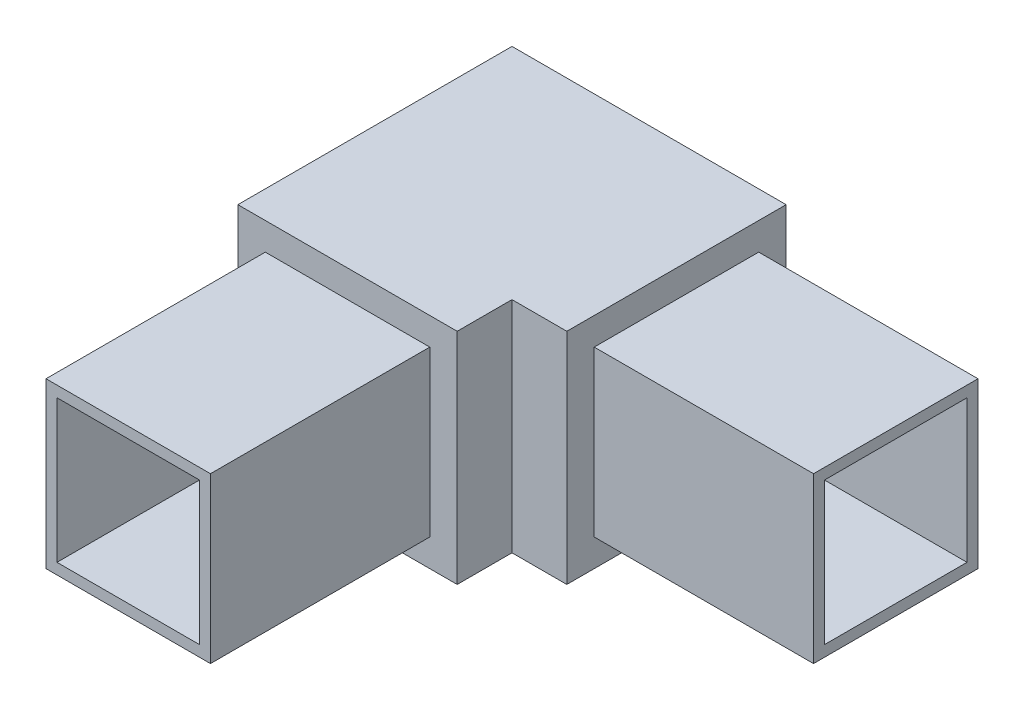
ISO-10303-21;
HEADER;
FILE_DESCRIPTION(('STEP AP214'),'2;1');
FILE_NAME('part.step','',(''),(''),'','','');
FILE_SCHEMA(('AUTOMOTIVE_DESIGN { 1 0 10303 214 1 1 1 1 }'));
ENDSEC;
DATA;
#1=APPLICATION_CONTEXT('core data for automotive mechanical design processes');
#2=APPLICATION_PROTOCOL_DEFINITION('international standard','automotive_design',2000,#1);
#3=PRODUCT_CONTEXT('',#1,'mechanical');
#4=PRODUCT('Part','Part','',(#3));
#5=PRODUCT_RELATED_PRODUCT_CATEGORY('part','',(#4));
#6=PRODUCT_DEFINITION_FORMATION('','',#4);
#7=PRODUCT_DEFINITION_CONTEXT('part definition',#1,'design');
#8=PRODUCT_DEFINITION('design','',#6,#7);
#9=PRODUCT_DEFINITION_SHAPE('','',#8);
#10=(LENGTH_UNIT() NAMED_UNIT(*) SI_UNIT(.MILLI.,.METRE.));
#11=(NAMED_UNIT(*) PLANE_ANGLE_UNIT() SI_UNIT($,.RADIAN.));
#12=(NAMED_UNIT(*) SI_UNIT($,.STERADIAN.) SOLID_ANGLE_UNIT());
#13=UNCERTAINTY_MEASURE_WITH_UNIT(LENGTH_MEASURE(1.E-05),#10,'distance_accuracy_value','');
#14=(GEOMETRIC_REPRESENTATION_CONTEXT(3) GLOBAL_UNCERTAINTY_ASSIGNED_CONTEXT((#13)) GLOBAL_UNIT_ASSIGNED_CONTEXT((#10,
#11,#12)) REPRESENTATION_CONTEXT('',''));
#15=CARTESIAN_POINT('',(0.,0.,0.));
#16=DIRECTION('',(0.,0.,1.));
#17=DIRECTION('',(1.,0.,0.));
#18=AXIS2_PLACEMENT_3D('',#15,#16,#17);
#19=CARTESIAN_POINT('',(70.,40.,-1082.0432663456));
#20=DIRECTION('',(-1.,0.,0.));
#21=DIRECTION('',(0.,0.,-1.));
#22=AXIS2_PLACEMENT_3D('',#19,#20,#21);
#23=PLANE('',#22);
#24=DIRECTION('',(0.,-1.,0.));
#25=VECTOR('',#24,1.);
#26=CARTESIAN_POINT('',(70.,35.,-1115.));
#27=LINE('',#26,#25);
#28=CARTESIAN_POINT('',(70.,35.,-1115.));
#29=VERTEX_POINT('',#28);
#30=CARTESIAN_POINT('',(70.,5.,-1115.));
#31=VERTEX_POINT('',#30);
#32=EDGE_CURVE('E383',#29,#31,#27,.T.);
#33=ORIENTED_EDGE('',*,*,#32,.F.);
#34=DIRECTION('',(0.,0.,-1.));
#35=VECTOR('',#34,1.);
#36=CARTESIAN_POINT('',(70.,35.,-1085.));
#37=LINE('',#36,#35);
#38=CARTESIAN_POINT('',(70.,35.,-1085.));
#39=VERTEX_POINT('',#38);
#40=EDGE_CURVE('E388',#39,#29,#37,.T.);
#41=ORIENTED_EDGE('',*,*,#40,.F.);
#42=DIRECTION('',(0.,1.,0.));
#43=VECTOR('',#42,1.);
#44=CARTESIAN_POINT('',(70.,5.,-1085.));
#45=LINE('',#44,#43);
#46=CARTESIAN_POINT('',(70.,5.,-1085.));
#47=VERTEX_POINT('',#46);
#48=EDGE_CURVE('E403',#47,#39,#45,.T.);
#49=ORIENTED_EDGE('',*,*,#48,.F.);
#50=DIRECTION('',(0.,0.,1.));
#51=VECTOR('',#50,1.);
#52=CARTESIAN_POINT('',(70.,5.,-1115.));
#53=LINE('',#52,#51);
#54=EDGE_CURVE('E400',#31,#47,#53,.T.);
#55=ORIENTED_EDGE('',*,*,#54,.F.);
#56=EDGE_LOOP('',(#33,#41,#49,#55));
#57=FACE_BOUND('',#56,.T.);
#58=DIRECTION('',(0.,-1.,0.));
#59=VECTOR('',#58,1.);
#60=CARTESIAN_POINT('',(70.,35.,-1113.));
#61=LINE('',#60,#59);
#62=CARTESIAN_POINT('',(70.,33.,-1113.));
#63=VERTEX_POINT('',#62);
#64=CARTESIAN_POINT('',(70.,7.,-1113.));
#65=VERTEX_POINT('',#64);
#66=EDGE_CURVE('E239',#63,#65,#61,.T.);
#67=ORIENTED_EDGE('',*,*,#66,.T.);
#68=DIRECTION('',(0.,0.,1.));
#69=VECTOR('',#68,1.);
#70=CARTESIAN_POINT('',(70.,7.,-1115.));
#71=LINE('',#70,#69);
#72=CARTESIAN_POINT('',(70.,7.,-1087.));
#73=VERTEX_POINT('',#72);
#74=EDGE_CURVE('E322',#65,#73,#71,.T.);
#75=ORIENTED_EDGE('',*,*,#74,.T.);
#76=DIRECTION('',(0.,1.,0.));
#77=VECTOR('',#76,1.);
#78=CARTESIAN_POINT('',(70.,5.,-1087.));
#79=LINE('',#78,#77);
#80=CARTESIAN_POINT('',(70.,33.,-1087.));
#81=VERTEX_POINT('',#80);
#82=EDGE_CURVE('E325',#73,#81,#79,.T.);
#83=ORIENTED_EDGE('',*,*,#82,.T.);
#84=DIRECTION('',(0.,0.,-1.));
#85=VECTOR('',#84,1.);
#86=CARTESIAN_POINT('',(70.,33.,-1085.));
#87=LINE('',#86,#85);
#88=EDGE_CURVE('E294',#81,#63,#87,.T.);
#89=ORIENTED_EDGE('',*,*,#88,.T.);
#90=EDGE_LOOP('',(#67,#75,#83,#89));
#91=FACE_BOUND('',#90,.T.);
#92=ADVANCED_FACE('F32',(#57,#91),#23,.F.);
#93=CARTESIAN_POINT('',(-103.501393306404,40.,-1082.0432663456));
#94=DIRECTION('',(0.,1.,0.));
#95=DIRECTION('',(0.,0.,-1.));
#96=AXIS2_PLACEMENT_3D('',#93,#94,#95);
#97=PLANE('',#96);
#98=DIRECTION('',(0.,0.,1.));
#99=VECTOR('',#98,1.);
#100=CARTESIAN_POINT('',(20.,40.,-1082.0432663456));
#101=LINE('',#100,#99);
#102=CARTESIAN_POINT('',(20.,40.,-1080.));
#103=VERTEX_POINT('',#102);
#104=CARTESIAN_POINT('',(20.,40.,-1070.));
#105=VERTEX_POINT('',#104);
#106=EDGE_CURVE('E436',#103,#105,#101,.T.);
#107=ORIENTED_EDGE('',*,*,#106,.F.);
#108=DIRECTION('',(1.,0.,0.));
#109=VECTOR('',#108,1.);
#110=CARTESIAN_POINT('',(-103.501393306404,40.,-1080.));
#111=LINE('',#110,#109);
#112=CARTESIAN_POINT('',(30.,40.,-1080.));
#113=VERTEX_POINT('',#112);
#114=EDGE_CURVE('E433',#103,#113,#111,.T.);
#115=ORIENTED_EDGE('',*,*,#114,.T.);
#116=DIRECTION('',(0.,0.,-1.));
#117=VECTOR('',#116,1.);
#118=CARTESIAN_POINT('',(30.,40.,-1080.));
#119=LINE('',#118,#117);
#120=CARTESIAN_POINT('',(30.,40.,-1120.));
#121=VERTEX_POINT('',#120);
#122=EDGE_CURVE('E422',#113,#121,#119,.T.);
#123=ORIENTED_EDGE('',*,*,#122,.T.);
#124=DIRECTION('',(-1.,0.,0.));
#125=VECTOR('',#124,1.);
#126=CARTESIAN_POINT('',(-103.501393306404,40.,-1120.));
#127=LINE('',#126,#125);
#128=CARTESIAN_POINT('',(-20.,40.,-1120.));
#129=VERTEX_POINT('',#128);
#130=EDGE_CURVE('E429',#121,#129,#127,.T.);
#131=ORIENTED_EDGE('',*,*,#130,.T.);
#132=DIRECTION('',(0.,0.,1.));
#133=VECTOR('',#132,1.);
#134=CARTESIAN_POINT('',(-20.,40.,-1082.0432663456));
#135=LINE('',#134,#133);
#136=CARTESIAN_POINT('',(-20.,40.,-1070.));
#137=VERTEX_POINT('',#136);
#138=EDGE_CURVE('E426',#129,#137,#135,.T.);
#139=ORIENTED_EDGE('',*,*,#138,.T.);
#140=DIRECTION('',(1.,0.,0.));
#141=VECTOR('',#140,1.);
#142=CARTESIAN_POINT('',(-20.,40.,-1070.));
#143=LINE('',#142,#141);
#144=EDGE_CURVE('E380',#137,#105,#143,.T.);
#145=ORIENTED_EDGE('',*,*,#144,.T.);
#146=EDGE_LOOP('',(#107,#115,#123,#131,#139,#145));
#147=FACE_BOUND('',#146,.T.);
#148=ADVANCED_FACE('F468',(#147),#97,.T.);
#149=CARTESIAN_POINT('',(-103.501393306404,0.,-1082.0432663456));
#150=DIRECTION('',(0.,1.,0.));
#151=DIRECTION('',(0.,0.,-1.));
#152=AXIS2_PLACEMENT_3D('',#149,#150,#151);
#153=PLANE('',#152);
#154=DIRECTION('',(-1.,0.,0.));
#155=VECTOR('',#154,1.);
#156=CARTESIAN_POINT('',(20.,0.,-1070.));
#157=LINE('',#156,#155);
#158=CARTESIAN_POINT('',(20.,0.,-1070.));
#159=VERTEX_POINT('',#158);
#160=CARTESIAN_POINT('',(-20.,0.,-1070.));
#161=VERTEX_POINT('',#160);
#162=EDGE_CURVE('E375',#159,#161,#157,.T.);
#163=ORIENTED_EDGE('',*,*,#162,.T.);
#164=DIRECTION('',(0.,0.,1.));
#165=VECTOR('',#164,1.);
#166=CARTESIAN_POINT('',(-20.,0.,-1082.0432663456));
#167=LINE('',#166,#165);
#168=CARTESIAN_POINT('',(-20.,0.,-1120.));
#169=VERTEX_POINT('',#168);
#170=EDGE_CURVE('E425',#169,#161,#167,.T.);
#171=ORIENTED_EDGE('',*,*,#170,.F.);
#172=DIRECTION('',(-1.,0.,0.));
#173=VECTOR('',#172,1.);
#174=CARTESIAN_POINT('',(-103.501393306404,0.,-1120.));
#175=LINE('',#174,#173);
#176=CARTESIAN_POINT('',(30.,0.,-1120.));
#177=VERTEX_POINT('',#176);
#178=EDGE_CURVE('E441',#177,#169,#175,.T.);
#179=ORIENTED_EDGE('',*,*,#178,.F.);
#180=DIRECTION('',(0.,0.,1.));
#181=VECTOR('',#180,1.);
#182=CARTESIAN_POINT('',(30.,0.,-1120.));
#183=LINE('',#182,#181);
#184=CARTESIAN_POINT('',(30.,0.,-1080.));
#185=VERTEX_POINT('',#184);
#186=EDGE_CURVE('E417',#177,#185,#183,.T.);
#187=ORIENTED_EDGE('',*,*,#186,.T.);
#188=DIRECTION('',(1.,0.,0.));
#189=VECTOR('',#188,1.);
#190=CARTESIAN_POINT('',(-103.501393306404,0.,-1080.));
#191=LINE('',#190,#189);
#192=CARTESIAN_POINT('',(20.,0.,-1080.));
#193=VERTEX_POINT('',#192);
#194=EDGE_CURVE('E444',#193,#185,#191,.T.);
#195=ORIENTED_EDGE('',*,*,#194,.F.);
#196=DIRECTION('',(0.,0.,1.));
#197=VECTOR('',#196,1.);
#198=CARTESIAN_POINT('',(20.,0.,-1082.0432663456));
#199=LINE('',#198,#197);
#200=EDGE_CURVE('E430',#193,#159,#199,.T.);
#201=ORIENTED_EDGE('',*,*,#200,.T.);
#202=EDGE_LOOP('',(#163,#171,#179,#187,#195,#201));
#203=FACE_BOUND('',#202,.T.);
#204=ADVANCED_FACE('F459',(#203),#153,.F.);
#205=CARTESIAN_POINT('',(-20.,40.,-1082.0432663456));
#206=DIRECTION('',(-1.,0.,0.));
#207=DIRECTION('',(0.,0.,-1.));
#208=AXIS2_PLACEMENT_3D('',#205,#206,#207);
#209=PLANE('',#208);
#210=CARTESIAN_POINT('',(-20.,20.,-1100.));
#211=DIRECTION('',(1.,0.,0.));
#212=DIRECTION('',(0.,0.,-1.));
#213=AXIS2_PLACEMENT_3D('',#210,#211,#212);
#214=CIRCLE('',#213,10.);
#215=CARTESIAN_POINT('',(-20.,20.,-1110.));
#216=VERTEX_POINT('',#215);
#217=EDGE_CURVE('E253',#216,#216,#214,.T.);
#218=ORIENTED_EDGE('',*,*,#217,.T.);
#219=EDGE_LOOP('',(#218));
#220=FACE_BOUND('',#219,.T.);
#221=ORIENTED_EDGE('',*,*,#138,.F.);
#222=DIRECTION('',(0.,-1.,0.));
#223=VECTOR('',#222,1.);
#224=CARTESIAN_POINT('',(-20.,40.,-1120.));
#225=LINE('',#224,#223);
#226=EDGE_CURVE('E11',#129,#169,#225,.T.);
#227=ORIENTED_EDGE('',*,*,#226,.T.);
#228=ORIENTED_EDGE('',*,*,#170,.T.);
#229=DIRECTION('',(0.,1.,0.));
#230=VECTOR('',#229,1.);
#231=CARTESIAN_POINT('',(-20.,0.,-1070.));
#232=LINE('',#231,#230);
#233=EDGE_CURVE('E378',#161,#137,#232,.T.);
#234=ORIENTED_EDGE('',*,*,#233,.T.);
#235=EDGE_LOOP('',(#221,#227,#228,#234));
#236=FACE_BOUND('',#235,.T.);
#237=ADVANCED_FACE('F34',(#220,#236),#209,.T.);
#238=CARTESIAN_POINT('',(20.,40.,-1082.0432663456));
#239=DIRECTION('',(-1.,0.,0.));
#240=DIRECTION('',(0.,0.,-1.));
#241=AXIS2_PLACEMENT_3D('',#238,#239,#240);
#242=PLANE('',#241);
#243=DIRECTION('',(0.,-1.,0.));
#244=VECTOR('',#243,1.);
#245=CARTESIAN_POINT('',(20.,40.,-1070.));
#246=LINE('',#245,#244);
#247=EDGE_CURVE('E365',#105,#159,#246,.T.);
#248=ORIENTED_EDGE('',*,*,#247,.T.);
#249=ORIENTED_EDGE('',*,*,#200,.F.);
#250=DIRECTION('',(0.,-1.,0.));
#251=VECTOR('',#250,1.);
#252=CARTESIAN_POINT('',(20.,40.,-1080.));
#253=LINE('',#252,#251);
#254=EDGE_CURVE('E41',#103,#193,#253,.T.);
#255=ORIENTED_EDGE('',*,*,#254,.F.);
#256=ORIENTED_EDGE('',*,*,#106,.T.);
#257=EDGE_LOOP('',(#248,#249,#255,#256));
#258=FACE_BOUND('',#257,.T.);
#259=ADVANCED_FACE('F456',(#258),#242,.F.);
#260=CARTESIAN_POINT('',(-103.501393306404,40.,-1120.));
#261=DIRECTION('',(0.,0.,-1.));
#262=DIRECTION('',(1.,0.,0.));
#263=AXIS2_PLACEMENT_3D('',#260,#261,#262);
#264=PLANE('',#263);
#265=ORIENTED_EDGE('',*,*,#178,.T.);
#266=ORIENTED_EDGE('',*,*,#226,.F.);
#267=ORIENTED_EDGE('',*,*,#130,.F.);
#268=DIRECTION('',(0.,-1.,0.));
#269=VECTOR('',#268,1.);
#270=CARTESIAN_POINT('',(30.,40.,-1120.));
#271=LINE('',#270,#269);
#272=EDGE_CURVE('E410',#121,#177,#271,.T.);
#273=ORIENTED_EDGE('',*,*,#272,.T.);
#274=EDGE_LOOP('',(#265,#266,#267,#273));
#275=FACE_BOUND('',#274,.T.);
#276=ADVANCED_FACE('F475',(#275),#264,.T.);
#277=CARTESIAN_POINT('',(-103.501393306404,40.,-1080.));
#278=DIRECTION('',(0.,0.,1.));
#279=DIRECTION('',(-1.,0.,0.));
#280=AXIS2_PLACEMENT_3D('',#277,#278,#279);
#281=PLANE('',#280);
#282=ORIENTED_EDGE('',*,*,#114,.F.);
#283=ORIENTED_EDGE('',*,*,#254,.T.);
#284=ORIENTED_EDGE('',*,*,#194,.T.);
#285=DIRECTION('',(0.,1.,0.));
#286=VECTOR('',#285,1.);
#287=CARTESIAN_POINT('',(30.,0.,-1080.));
#288=LINE('',#287,#286);
#289=EDGE_CURVE('E420',#185,#113,#288,.T.);
#290=ORIENTED_EDGE('',*,*,#289,.T.);
#291=EDGE_LOOP('',(#282,#283,#284,#290));
#292=FACE_BOUND('',#291,.T.);
#293=ADVANCED_FACE('F452',(#292),#281,.T.);
#294=CARTESIAN_POINT('',(30.,0.,-1120.));
#295=DIRECTION('',(1.,0.,0.));
#296=DIRECTION('',(0.,0.,1.));
#297=AXIS2_PLACEMENT_3D('',#294,#295,#296);
#298=PLANE('',#297);
#299=DIRECTION('',(0.,0.,-1.));
#300=VECTOR('',#299,1.);
#301=CARTESIAN_POINT('',(30.,35.,-1085.));
#302=LINE('',#301,#300);
#303=CARTESIAN_POINT('',(30.,35.,-1085.));
#304=VERTEX_POINT('',#303);
#305=CARTESIAN_POINT('',(30.,35.,-1115.));
#306=VERTEX_POINT('',#305);
#307=EDGE_CURVE('E394',#304,#306,#302,.T.);
#308=ORIENTED_EDGE('',*,*,#307,.T.);
#309=DIRECTION('',(0.,-1.,0.));
#310=VECTOR('',#309,1.);
#311=CARTESIAN_POINT('',(30.,35.,-1115.));
#312=LINE('',#311,#310);
#313=CARTESIAN_POINT('',(30.,5.,-1115.));
#314=VERTEX_POINT('',#313);
#315=EDGE_CURVE('E384',#306,#314,#312,.T.);
#316=ORIENTED_EDGE('',*,*,#315,.T.);
#317=DIRECTION('',(0.,0.,1.));
#318=VECTOR('',#317,1.);
#319=CARTESIAN_POINT('',(30.,5.,-1115.));
#320=LINE('',#319,#318);
#321=CARTESIAN_POINT('',(30.,5.,-1085.));
#322=VERTEX_POINT('',#321);
#323=EDGE_CURVE('E387',#314,#322,#320,.T.);
#324=ORIENTED_EDGE('',*,*,#323,.T.);
#325=DIRECTION('',(0.,1.,0.));
#326=VECTOR('',#325,1.);
#327=CARTESIAN_POINT('',(30.,5.,-1085.));
#328=LINE('',#327,#326);
#329=EDGE_CURVE('E391',#322,#304,#328,.T.);
#330=ORIENTED_EDGE('',*,*,#329,.T.);
#331=EDGE_LOOP('',(#308,#316,#324,#330));
#332=FACE_BOUND('',#331,.T.);
#333=ORIENTED_EDGE('',*,*,#272,.F.);
#334=ORIENTED_EDGE('',*,*,#122,.F.);
#335=ORIENTED_EDGE('',*,*,#289,.F.);
#336=ORIENTED_EDGE('',*,*,#186,.F.);
#337=EDGE_LOOP('',(#333,#334,#335,#336));
#338=FACE_BOUND('',#337,.T.);
#339=ADVANCED_FACE('F464',(#332,#338),#298,.T.);
#340=CARTESIAN_POINT('',(30.,35.,-1115.));
#341=DIRECTION('',(0.,0.,-1.));
#342=DIRECTION('',(1.,0.,0.));
#343=AXIS2_PLACEMENT_3D('',#340,#341,#342);
#344=PLANE('',#343);
#345=ORIENTED_EDGE('',*,*,#32,.T.);
#346=DIRECTION('',(1.,0.,0.));
#347=VECTOR('',#346,1.);
#348=CARTESIAN_POINT('',(30.,5.,-1115.));
#349=LINE('',#348,#347);
#350=EDGE_CURVE('E397',#314,#31,#349,.T.);
#351=ORIENTED_EDGE('',*,*,#350,.F.);
#352=ORIENTED_EDGE('',*,*,#315,.F.);
#353=DIRECTION('',(1.,0.,0.));
#354=VECTOR('',#353,1.);
#355=CARTESIAN_POINT('',(30.,35.,-1115.));
#356=LINE('',#355,#354);
#357=EDGE_CURVE('E408',#306,#29,#356,.T.);
#358=ORIENTED_EDGE('',*,*,#357,.T.);
#359=EDGE_LOOP('',(#345,#351,#352,#358));
#360=FACE_BOUND('',#359,.T.);
#361=ADVANCED_FACE('F502',(#360),#344,.T.);
#362=CARTESIAN_POINT('',(30.,35.,-1085.));
#363=DIRECTION('',(0.,1.,0.));
#364=DIRECTION('',(0.,0.,-1.));
#365=AXIS2_PLACEMENT_3D('',#362,#363,#364);
#366=PLANE('',#365);
#367=ORIENTED_EDGE('',*,*,#40,.T.);
#368=ORIENTED_EDGE('',*,*,#357,.F.);
#369=ORIENTED_EDGE('',*,*,#307,.F.);
#370=DIRECTION('',(1.,0.,0.));
#371=VECTOR('',#370,1.);
#372=CARTESIAN_POINT('',(30.,35.,-1085.));
#373=LINE('',#372,#371);
#374=EDGE_CURVE('E411',#304,#39,#373,.T.);
#375=ORIENTED_EDGE('',*,*,#374,.T.);
#376=EDGE_LOOP('',(#367,#368,#369,#375));
#377=FACE_BOUND('',#376,.T.);
#378=ADVANCED_FACE('F506',(#377),#366,.T.);
#379=CARTESIAN_POINT('',(30.,5.,-1085.));
#380=DIRECTION('',(0.,0.,1.));
#381=DIRECTION('',(-1.,0.,0.));
#382=AXIS2_PLACEMENT_3D('',#379,#380,#381);
#383=PLANE('',#382);
#384=ORIENTED_EDGE('',*,*,#48,.T.);
#385=ORIENTED_EDGE('',*,*,#374,.F.);
#386=ORIENTED_EDGE('',*,*,#329,.F.);
#387=DIRECTION('',(1.,0.,0.));
#388=VECTOR('',#387,1.);
#389=CARTESIAN_POINT('',(30.,5.,-1085.));
#390=LINE('',#389,#388);
#391=EDGE_CURVE('E413',#322,#47,#390,.T.);
#392=ORIENTED_EDGE('',*,*,#391,.T.);
#393=EDGE_LOOP('',(#384,#385,#386,#392));
#394=FACE_BOUND('',#393,.T.);
#395=ADVANCED_FACE('F511',(#394),#383,.T.);
#396=CARTESIAN_POINT('',(30.,5.,-1115.));
#397=DIRECTION('',(0.,-1.,0.));
#398=DIRECTION('',(0.,0.,1.));
#399=AXIS2_PLACEMENT_3D('',#396,#397,#398);
#400=PLANE('',#399);
#401=ORIENTED_EDGE('',*,*,#54,.T.);
#402=ORIENTED_EDGE('',*,*,#391,.F.);
#403=ORIENTED_EDGE('',*,*,#323,.F.);
#404=ORIENTED_EDGE('',*,*,#350,.T.);
#405=EDGE_LOOP('',(#401,#402,#403,#404));
#406=FACE_BOUND('',#405,.T.);
#407=ADVANCED_FACE('F508',(#406),#400,.T.);
#408=CARTESIAN_POINT('',(20.,0.,-1070.));
#409=DIRECTION('',(0.,0.,1.));
#410=DIRECTION('',(-1.,0.,0.));
#411=AXIS2_PLACEMENT_3D('',#408,#409,#410);
#412=PLANE('',#411);
#413=DIRECTION('',(1.,0.,0.));
#414=VECTOR('',#413,1.);
#415=CARTESIAN_POINT('',(-15.,35.,-1070.));
#416=LINE('',#415,#414);
#417=CARTESIAN_POINT('',(-15.,35.,-1070.));
#418=VERTEX_POINT('',#417);
#419=CARTESIAN_POINT('',(15.,35.,-1070.));
#420=VERTEX_POINT('',#419);
#421=EDGE_CURVE('E351',#418,#420,#416,.T.);
#422=ORIENTED_EDGE('',*,*,#421,.T.);
#423=DIRECTION('',(0.,-1.,0.));
#424=VECTOR('',#423,1.);
#425=CARTESIAN_POINT('',(15.,35.,-1070.));
#426=LINE('',#425,#424);
#427=CARTESIAN_POINT('',(15.,5.,-1070.));
#428=VERTEX_POINT('',#427);
#429=EDGE_CURVE('E341',#420,#428,#426,.T.);
#430=ORIENTED_EDGE('',*,*,#429,.T.);
#431=DIRECTION('',(-1.,0.,0.));
#432=VECTOR('',#431,1.);
#433=CARTESIAN_POINT('',(15.,5.,-1070.));
#434=LINE('',#433,#432);
#435=CARTESIAN_POINT('',(-15.,5.,-1070.));
#436=VERTEX_POINT('',#435);
#437=EDGE_CURVE('E344',#428,#436,#434,.T.);
#438=ORIENTED_EDGE('',*,*,#437,.T.);
#439=DIRECTION('',(0.,1.,0.));
#440=VECTOR('',#439,1.);
#441=CARTESIAN_POINT('',(-15.,5.,-1070.));
#442=LINE('',#441,#440);
#443=EDGE_CURVE('E348',#436,#418,#442,.T.);
#444=ORIENTED_EDGE('',*,*,#443,.T.);
#445=EDGE_LOOP('',(#422,#430,#438,#444));
#446=FACE_BOUND('',#445,.T.);
#447=ORIENTED_EDGE('',*,*,#247,.F.);
#448=ORIENTED_EDGE('',*,*,#144,.F.);
#449=ORIENTED_EDGE('',*,*,#233,.F.);
#450=ORIENTED_EDGE('',*,*,#162,.F.);
#451=EDGE_LOOP('',(#447,#448,#449,#450));
#452=FACE_BOUND('',#451,.T.);
#453=ADVANCED_FACE('F472',(#446,#452),#412,.T.);
#454=CARTESIAN_POINT('',(15.,35.,-1070.));
#455=DIRECTION('',(1.,0.,0.));
#456=DIRECTION('',(0.,0.,1.));
#457=AXIS2_PLACEMENT_3D('',#454,#455,#456);
#458=PLANE('',#457);
#459=DIRECTION('',(0.,-1.,0.));
#460=VECTOR('',#459,1.);
#461=CARTESIAN_POINT('',(15.,35.,-1030.));
#462=LINE('',#461,#460);
#463=CARTESIAN_POINT('',(15.,35.,-1030.));
#464=VERTEX_POINT('',#463);
#465=CARTESIAN_POINT('',(15.,5.,-1030.));
#466=VERTEX_POINT('',#465);
#467=EDGE_CURVE('E269',#464,#466,#462,.T.);
#468=ORIENTED_EDGE('',*,*,#467,.T.);
#469=DIRECTION('',(0.,0.,1.));
#470=VECTOR('',#469,1.);
#471=CARTESIAN_POINT('',(15.,5.,-1070.));
#472=LINE('',#471,#470);
#473=EDGE_CURVE('E354',#428,#466,#472,.T.);
#474=ORIENTED_EDGE('',*,*,#473,.F.);
#475=ORIENTED_EDGE('',*,*,#429,.F.);
#476=DIRECTION('',(0.,0.,1.));
#477=VECTOR('',#476,1.);
#478=CARTESIAN_POINT('',(15.,35.,-1070.));
#479=LINE('',#478,#477);
#480=EDGE_CURVE('E362',#420,#464,#479,.T.);
#481=ORIENTED_EDGE('',*,*,#480,.T.);
#482=EDGE_LOOP('',(#468,#474,#475,#481));
#483=FACE_BOUND('',#482,.T.);
#484=ADVANCED_FACE('F521',(#483),#458,.T.);
#485=CARTESIAN_POINT('',(-15.,35.,-1070.));
#486=DIRECTION('',(0.,1.,0.));
#487=DIRECTION('',(0.,0.,-1.));
#488=AXIS2_PLACEMENT_3D('',#485,#486,#487);
#489=PLANE('',#488);
#490=DIRECTION('',(1.,0.,0.));
#491=VECTOR('',#490,1.);
#492=CARTESIAN_POINT('',(-15.,35.,-1030.));
#493=LINE('',#492,#491);
#494=CARTESIAN_POINT('',(-15.,35.,-1030.));
#495=VERTEX_POINT('',#494);
#496=EDGE_CURVE('E345',#495,#464,#493,.T.);
#497=ORIENTED_EDGE('',*,*,#496,.T.);
#498=ORIENTED_EDGE('',*,*,#480,.F.);
#499=ORIENTED_EDGE('',*,*,#421,.F.);
#500=DIRECTION('',(0.,0.,1.));
#501=VECTOR('',#500,1.);
#502=CARTESIAN_POINT('',(-15.,35.,-1070.));
#503=LINE('',#502,#501);
#504=EDGE_CURVE('E366',#418,#495,#503,.T.);
#505=ORIENTED_EDGE('',*,*,#504,.T.);
#506=EDGE_LOOP('',(#497,#498,#499,#505));
#507=FACE_BOUND('',#506,.T.);
#508=ADVANCED_FACE('F525',(#507),#489,.T.);
#509=CARTESIAN_POINT('',(-15.,5.,-1070.));
#510=DIRECTION('',(-1.,0.,0.));
#511=DIRECTION('',(0.,0.,-1.));
#512=AXIS2_PLACEMENT_3D('',#509,#510,#511);
#513=PLANE('',#512);
#514=DIRECTION('',(0.,1.,0.));
#515=VECTOR('',#514,1.);
#516=CARTESIAN_POINT('',(-15.,5.,-1030.));
#517=LINE('',#516,#515);
#518=CARTESIAN_POINT('',(-15.,5.,-1030.));
#519=VERTEX_POINT('',#518);
#520=EDGE_CURVE('E359',#519,#495,#517,.T.);
#521=ORIENTED_EDGE('',*,*,#520,.T.);
#522=ORIENTED_EDGE('',*,*,#504,.F.);
#523=ORIENTED_EDGE('',*,*,#443,.F.);
#524=DIRECTION('',(0.,0.,1.));
#525=VECTOR('',#524,1.);
#526=CARTESIAN_POINT('',(-15.,5.,-1070.));
#527=LINE('',#526,#525);
#528=EDGE_CURVE('E369',#436,#519,#527,.T.);
#529=ORIENTED_EDGE('',*,*,#528,.T.);
#530=EDGE_LOOP('',(#521,#522,#523,#529));
#531=FACE_BOUND('',#530,.T.);
#532=ADVANCED_FACE('F529',(#531),#513,.T.);
#533=CARTESIAN_POINT('',(15.,5.,-1070.));
#534=DIRECTION('',(0.,-1.,0.));
#535=DIRECTION('',(0.,0.,1.));
#536=AXIS2_PLACEMENT_3D('',#533,#534,#535);
#537=PLANE('',#536);
#538=DIRECTION('',(-1.,0.,0.));
#539=VECTOR('',#538,1.);
#540=CARTESIAN_POINT('',(15.,5.,-1030.));
#541=LINE('',#540,#539);
#542=EDGE_CURVE('E357',#466,#519,#541,.T.);
#543=ORIENTED_EDGE('',*,*,#542,.T.);
#544=ORIENTED_EDGE('',*,*,#528,.F.);
#545=ORIENTED_EDGE('',*,*,#437,.F.);
#546=ORIENTED_EDGE('',*,*,#473,.T.);
#547=EDGE_LOOP('',(#543,#544,#545,#546));
#548=FACE_BOUND('',#547,.T.);
#549=ADVANCED_FACE('F496',(#548),#537,.T.);
#550=CARTESIAN_POINT('',(-103.501393306404,40.,-1030.));
#551=DIRECTION('',(0.,0.,1.));
#552=DIRECTION('',(-1.,0.,0.));
#553=AXIS2_PLACEMENT_3D('',#550,#551,#552);
#554=PLANE('',#553);
#555=DIRECTION('',(1.,0.,0.));
#556=VECTOR('',#555,1.);
#557=CARTESIAN_POINT('',(-103.501393306404,33.,-1030.));
#558=LINE('',#557,#556);
#559=CARTESIAN_POINT('',(-13.,33.,-1030.));
#560=VERTEX_POINT('',#559);
#561=CARTESIAN_POINT('',(13.,33.,-1030.));
#562=VERTEX_POINT('',#561);
#563=EDGE_CURVE('E314',#560,#562,#558,.T.);
#564=ORIENTED_EDGE('',*,*,#563,.T.);
#565=DIRECTION('',(0.,-1.,0.));
#566=VECTOR('',#565,1.);
#567=CARTESIAN_POINT('',(13.,40.,-1030.));
#568=LINE('',#567,#566);
#569=CARTESIAN_POINT('',(13.,7.,-1030.));
#570=VERTEX_POINT('',#569);
#571=EDGE_CURVE('E330',#562,#570,#568,.T.);
#572=ORIENTED_EDGE('',*,*,#571,.T.);
#573=DIRECTION('',(-1.,0.,0.));
#574=VECTOR('',#573,1.);
#575=CARTESIAN_POINT('',(-103.501393306404,7.,-1030.));
#576=LINE('',#575,#574);
#577=CARTESIAN_POINT('',(-13.,7.,-1030.));
#578=VERTEX_POINT('',#577);
#579=EDGE_CURVE('E333',#570,#578,#576,.T.);
#580=ORIENTED_EDGE('',*,*,#579,.T.);
#581=DIRECTION('',(0.,1.,0.));
#582=VECTOR('',#581,1.);
#583=CARTESIAN_POINT('',(-13.,40.,-1030.));
#584=LINE('',#583,#582);
#585=EDGE_CURVE('E336',#578,#560,#584,.T.);
#586=ORIENTED_EDGE('',*,*,#585,.T.);
#587=EDGE_LOOP('',(#564,#572,#580,#586));
#588=FACE_BOUND('',#587,.T.);
#589=ORIENTED_EDGE('',*,*,#496,.F.);
#590=ORIENTED_EDGE('',*,*,#520,.F.);
#591=ORIENTED_EDGE('',*,*,#542,.F.);
#592=ORIENTED_EDGE('',*,*,#467,.F.);
#593=EDGE_LOOP('',(#589,#590,#591,#592));
#594=FACE_BOUND('',#593,.T.);
#595=ADVANCED_FACE('F493',(#588,#594),#554,.T.);
#596=CARTESIAN_POINT('',(-103.501393306404,38.,-1082.0432663456));
#597=DIRECTION('',(0.,1.,0.));
#598=DIRECTION('',(0.,0.,-1.));
#599=AXIS2_PLACEMENT_3D('',#596,#597,#598);
#600=PLANE('',#599);
#601=DIRECTION('',(0.,0.,1.));
#602=VECTOR('',#601,1.);
#603=CARTESIAN_POINT('',(18.,38.,-1082.0432663456));
#604=LINE('',#603,#602);
#605=CARTESIAN_POINT('',(18.,38.,-1082.));
#606=VERTEX_POINT('',#605);
#607=CARTESIAN_POINT('',(18.,38.,-1072.));
#608=VERTEX_POINT('',#607);
#609=EDGE_CURVE('E223',#606,#608,#604,.T.);
#610=ORIENTED_EDGE('',*,*,#609,.T.);
#611=DIRECTION('',(1.,0.,0.));
#612=VECTOR('',#611,1.);
#613=CARTESIAN_POINT('',(20.,38.,-1072.));
#614=LINE('',#613,#612);
#615=CARTESIAN_POINT('',(-18.,38.,-1072.));
#616=VERTEX_POINT('',#615);
#617=EDGE_CURVE('E233',#616,#608,#614,.T.);
#618=ORIENTED_EDGE('',*,*,#617,.F.);
#619=DIRECTION('',(0.,0.,1.));
#620=VECTOR('',#619,1.);
#621=CARTESIAN_POINT('',(-18.,38.,-1082.0432663456));
#622=LINE('',#621,#620);
#623=CARTESIAN_POINT('',(-18.,38.,-1118.));
#624=VERTEX_POINT('',#623);
#625=EDGE_CURVE('E255',#624,#616,#622,.T.);
#626=ORIENTED_EDGE('',*,*,#625,.F.);
#627=DIRECTION('',(-1.,0.,0.));
#628=VECTOR('',#627,1.);
#629=CARTESIAN_POINT('',(-103.501393306404,38.,-1118.));
#630=LINE('',#629,#628);
#631=CARTESIAN_POINT('',(28.,38.,-1118.));
#632=VERTEX_POINT('',#631);
#633=EDGE_CURVE('E250',#632,#624,#630,.T.);
#634=ORIENTED_EDGE('',*,*,#633,.F.);
#635=DIRECTION('',(0.,0.,-1.));
#636=VECTOR('',#635,1.);
#637=CARTESIAN_POINT('',(28.,38.,-1120.));
#638=LINE('',#637,#636);
#639=CARTESIAN_POINT('',(28.,38.,-1082.));
#640=VERTEX_POINT('',#639);
#641=EDGE_CURVE('E259',#640,#632,#638,.T.);
#642=ORIENTED_EDGE('',*,*,#641,.F.);
#643=DIRECTION('',(1.,0.,0.));
#644=VECTOR('',#643,1.);
#645=CARTESIAN_POINT('',(-103.501393306404,38.,-1082.));
#646=LINE('',#645,#644);
#647=EDGE_CURVE('E245',#606,#640,#646,.T.);
#648=ORIENTED_EDGE('',*,*,#647,.F.);
#649=EDGE_LOOP('',(#610,#618,#626,#634,#642,#648));
#650=FACE_BOUND('',#649,.T.);
#651=ADVANCED_FACE('F242',(#650),#600,.F.);
#652=CARTESIAN_POINT('',(-103.501393306404,2.,-1082.0432663456));
#653=DIRECTION('',(0.,1.,0.));
#654=DIRECTION('',(0.,0.,-1.));
#655=AXIS2_PLACEMENT_3D('',#652,#653,#654);
#656=PLANE('',#655);
#657=DIRECTION('',(-1.,0.,0.));
#658=VECTOR('',#657,1.);
#659=CARTESIAN_POINT('',(-103.501393306404,2.,-1072.));
#660=LINE('',#659,#658);
#661=CARTESIAN_POINT('',(18.,2.,-1072.));
#662=VERTEX_POINT('',#661);
#663=CARTESIAN_POINT('',(-18.,2.,-1072.));
#664=VERTEX_POINT('',#663);
#665=EDGE_CURVE('E229',#662,#664,#660,.T.);
#666=ORIENTED_EDGE('',*,*,#665,.F.);
#667=DIRECTION('',(0.,0.,1.));
#668=VECTOR('',#667,1.);
#669=CARTESIAN_POINT('',(18.,2.,-1082.0432663456));
#670=LINE('',#669,#668);
#671=CARTESIAN_POINT('',(18.,2.,-1082.));
#672=VERTEX_POINT('',#671);
#673=EDGE_CURVE('E225',#672,#662,#670,.T.);
#674=ORIENTED_EDGE('',*,*,#673,.F.);
#675=DIRECTION('',(1.,0.,0.));
#676=VECTOR('',#675,1.);
#677=CARTESIAN_POINT('',(-103.501393306404,2.,-1082.));
#678=LINE('',#677,#676);
#679=CARTESIAN_POINT('',(28.,2.,-1082.));
#680=VERTEX_POINT('',#679);
#681=EDGE_CURVE('E272',#672,#680,#678,.T.);
#682=ORIENTED_EDGE('',*,*,#681,.T.);
#683=DIRECTION('',(0.,0.,1.));
#684=VECTOR('',#683,1.);
#685=CARTESIAN_POINT('',(28.,2.,-1082.0432663456));
#686=LINE('',#685,#684);
#687=CARTESIAN_POINT('',(28.,2.,-1118.));
#688=VERTEX_POINT('',#687);
#689=EDGE_CURVE('E275',#688,#680,#686,.T.);
#690=ORIENTED_EDGE('',*,*,#689,.F.);
#691=DIRECTION('',(-1.,0.,0.));
#692=VECTOR('',#691,1.);
#693=CARTESIAN_POINT('',(-103.501393306404,2.,-1118.));
#694=LINE('',#693,#692);
#695=CARTESIAN_POINT('',(-18.,2.,-1118.));
#696=VERTEX_POINT('',#695);
#697=EDGE_CURVE('E267',#688,#696,#694,.T.);
#698=ORIENTED_EDGE('',*,*,#697,.T.);
#699=DIRECTION('',(0.,0.,1.));
#700=VECTOR('',#699,1.);
#701=CARTESIAN_POINT('',(-18.,2.,-1082.0432663456));
#702=LINE('',#701,#700);
#703=EDGE_CURVE('E261',#696,#664,#702,.T.);
#704=ORIENTED_EDGE('',*,*,#703,.T.);
#705=EDGE_LOOP('',(#666,#674,#682,#690,#698,#704));
#706=FACE_BOUND('',#705,.T.);
#707=ADVANCED_FACE('F588',(#706),#656,.T.);
#708=CARTESIAN_POINT('',(-18.,40.,-1082.0432663456));
#709=DIRECTION('',(-1.,0.,0.));
#710=DIRECTION('',(0.,0.,-1.));
#711=AXIS2_PLACEMENT_3D('',#708,#709,#710);
#712=PLANE('',#711);
#713=CARTESIAN_POINT('',(-18.,20.,-1100.));
#714=DIRECTION('',(1.,0.,0.));
#715=DIRECTION('',(0.,0.,-1.));
#716=AXIS2_PLACEMENT_3D('',#713,#714,#715);
#717=CIRCLE('',#716,10.);
#718=CARTESIAN_POINT('',(-18.,20.,-1110.));
#719=VERTEX_POINT('',#718);
#720=EDGE_CURVE('E36',#719,#719,#717,.T.);
#721=ORIENTED_EDGE('',*,*,#720,.F.);
#722=EDGE_LOOP('',(#721));
#723=FACE_BOUND('',#722,.T.);
#724=ORIENTED_EDGE('',*,*,#625,.T.);
#725=DIRECTION('',(0.,1.,0.));
#726=VECTOR('',#725,1.);
#727=CARTESIAN_POINT('',(-18.,0.,-1072.));
#728=LINE('',#727,#726);
#729=EDGE_CURVE('E235',#664,#616,#728,.T.);
#730=ORIENTED_EDGE('',*,*,#729,.F.);
#731=ORIENTED_EDGE('',*,*,#703,.F.);
#732=DIRECTION('',(0.,-1.,0.));
#733=VECTOR('',#732,1.);
#734=CARTESIAN_POINT('',(-18.,40.,-1118.));
#735=LINE('',#734,#733);
#736=EDGE_CURVE('E248',#624,#696,#735,.T.);
#737=ORIENTED_EDGE('',*,*,#736,.F.);
#738=EDGE_LOOP('',(#724,#730,#731,#737));
#739=FACE_BOUND('',#738,.T.);
#740=ADVANCED_FACE('F585',(#723,#739),#712,.F.);
#741=CARTESIAN_POINT('',(18.,40.,-1082.0432663456));
#742=DIRECTION('',(-1.,0.,0.));
#743=DIRECTION('',(0.,0.,-1.));
#744=AXIS2_PLACEMENT_3D('',#741,#742,#743);
#745=PLANE('',#744);
#746=DIRECTION('',(0.,-1.,0.));
#747=VECTOR('',#746,1.);
#748=CARTESIAN_POINT('',(18.,40.,-1072.));
#749=LINE('',#748,#747);
#750=EDGE_CURVE('E219',#608,#662,#749,.T.);
#751=ORIENTED_EDGE('',*,*,#750,.F.);
#752=ORIENTED_EDGE('',*,*,#609,.F.);
#753=DIRECTION('',(0.,-1.,0.));
#754=VECTOR('',#753,1.);
#755=CARTESIAN_POINT('',(18.,40.,-1082.));
#756=LINE('',#755,#754);
#757=EDGE_CURVE('E246',#606,#672,#756,.T.);
#758=ORIENTED_EDGE('',*,*,#757,.T.);
#759=ORIENTED_EDGE('',*,*,#673,.T.);
#760=EDGE_LOOP('',(#751,#752,#758,#759));
#761=FACE_BOUND('',#760,.T.);
#762=ADVANCED_FACE('F221',(#761),#745,.T.);
#763=CARTESIAN_POINT('',(-103.501393306404,40.,-1118.));
#764=DIRECTION('',(0.,0.,-1.));
#765=DIRECTION('',(1.,0.,0.));
#766=AXIS2_PLACEMENT_3D('',#763,#764,#765);
#767=PLANE('',#766);
#768=ORIENTED_EDGE('',*,*,#697,.F.);
#769=DIRECTION('',(0.,-1.,0.));
#770=VECTOR('',#769,1.);
#771=CARTESIAN_POINT('',(28.,0.,-1118.));
#772=LINE('',#771,#770);
#773=EDGE_CURVE('E278',#632,#688,#772,.T.);
#774=ORIENTED_EDGE('',*,*,#773,.F.);
#775=ORIENTED_EDGE('',*,*,#633,.T.);
#776=ORIENTED_EDGE('',*,*,#736,.T.);
#777=EDGE_LOOP('',(#768,#774,#775,#776));
#778=FACE_BOUND('',#777,.T.);
#779=ADVANCED_FACE('F578',(#778),#767,.F.);
#780=CARTESIAN_POINT('',(-103.501393306404,40.,-1082.));
#781=DIRECTION('',(0.,0.,1.));
#782=DIRECTION('',(-1.,0.,0.));
#783=AXIS2_PLACEMENT_3D('',#780,#781,#782);
#784=PLANE('',#783);
#785=ORIENTED_EDGE('',*,*,#647,.T.);
#786=DIRECTION('',(0.,1.,0.));
#787=VECTOR('',#786,1.);
#788=CARTESIAN_POINT('',(28.,0.,-1082.));
#789=LINE('',#788,#787);
#790=EDGE_CURVE('E262',#680,#640,#789,.T.);
#791=ORIENTED_EDGE('',*,*,#790,.F.);
#792=ORIENTED_EDGE('',*,*,#681,.F.);
#793=ORIENTED_EDGE('',*,*,#757,.F.);
#794=EDGE_LOOP('',(#785,#791,#792,#793));
#795=FACE_BOUND('',#794,.T.);
#796=ADVANCED_FACE('F574',(#795),#784,.F.);
#797=CARTESIAN_POINT('',(28.,0.,-1120.));
#798=DIRECTION('',(1.,0.,0.));
#799=DIRECTION('',(0.,0.,1.));
#800=AXIS2_PLACEMENT_3D('',#797,#798,#799);
#801=PLANE('',#800);
#802=DIRECTION('',(0.,0.,-1.));
#803=VECTOR('',#802,1.);
#804=CARTESIAN_POINT('',(28.,33.,-1120.));
#805=LINE('',#804,#803);
#806=CARTESIAN_POINT('',(28.,33.,-1087.));
#807=VERTEX_POINT('',#806);
#808=CARTESIAN_POINT('',(28.,33.,-1113.));
#809=VERTEX_POINT('',#808);
#810=EDGE_CURVE('E282',#807,#809,#805,.T.);
#811=ORIENTED_EDGE('',*,*,#810,.F.);
#812=DIRECTION('',(0.,1.,0.));
#813=VECTOR('',#812,1.);
#814=CARTESIAN_POINT('',(28.,0.,-1087.));
#815=LINE('',#814,#813);
#816=CARTESIAN_POINT('',(28.,7.,-1087.));
#817=VERTEX_POINT('',#816);
#818=EDGE_CURVE('E286',#817,#807,#815,.T.);
#819=ORIENTED_EDGE('',*,*,#818,.F.);
#820=DIRECTION('',(0.,0.,1.));
#821=VECTOR('',#820,1.);
#822=CARTESIAN_POINT('',(28.,7.,-1120.));
#823=LINE('',#822,#821);
#824=CARTESIAN_POINT('',(28.,7.,-1113.));
#825=VERTEX_POINT('',#824);
#826=EDGE_CURVE('E288',#825,#817,#823,.T.);
#827=ORIENTED_EDGE('',*,*,#826,.F.);
#828=DIRECTION('',(0.,-1.,0.));
#829=VECTOR('',#828,1.);
#830=CARTESIAN_POINT('',(28.,0.,-1113.));
#831=LINE('',#830,#829);
#832=EDGE_CURVE('E291',#809,#825,#831,.T.);
#833=ORIENTED_EDGE('',*,*,#832,.F.);
#834=EDGE_LOOP('',(#811,#819,#827,#833));
#835=FACE_BOUND('',#834,.T.);
#836=ORIENTED_EDGE('',*,*,#773,.T.);
#837=ORIENTED_EDGE('',*,*,#689,.T.);
#838=ORIENTED_EDGE('',*,*,#790,.T.);
#839=ORIENTED_EDGE('',*,*,#641,.T.);
#840=EDGE_LOOP('',(#836,#837,#838,#839));
#841=FACE_BOUND('',#840,.T.);
#842=ADVANCED_FACE('F570',(#835,#841),#801,.F.);
#843=CARTESIAN_POINT('',(30.,35.,-1113.));
#844=DIRECTION('',(0.,0.,-1.));
#845=DIRECTION('',(1.,0.,0.));
#846=AXIS2_PLACEMENT_3D('',#843,#844,#845);
#847=PLANE('',#846);
#848=ORIENTED_EDGE('',*,*,#66,.F.);
#849=DIRECTION('',(1.,0.,0.));
#850=VECTOR('',#849,1.);
#851=CARTESIAN_POINT('',(30.,33.,-1113.));
#852=LINE('',#851,#850);
#853=EDGE_CURVE('E296',#809,#63,#852,.T.);
#854=ORIENTED_EDGE('',*,*,#853,.F.);
#855=ORIENTED_EDGE('',*,*,#832,.T.);
#856=DIRECTION('',(1.,0.,0.));
#857=VECTOR('',#856,1.);
#858=CARTESIAN_POINT('',(30.,7.,-1113.));
#859=LINE('',#858,#857);
#860=EDGE_CURVE('E285',#825,#65,#859,.T.);
#861=ORIENTED_EDGE('',*,*,#860,.T.);
#862=EDGE_LOOP('',(#848,#854,#855,#861));
#863=FACE_BOUND('',#862,.T.);
#864=ADVANCED_FACE('F566',(#863),#847,.F.);
#865=CARTESIAN_POINT('',(30.,33.,-1085.));
#866=DIRECTION('',(0.,1.,0.));
#867=DIRECTION('',(0.,0.,-1.));
#868=AXIS2_PLACEMENT_3D('',#865,#866,#867);
#869=PLANE('',#868);
#870=ORIENTED_EDGE('',*,*,#88,.F.);
#871=DIRECTION('',(1.,0.,0.));
#872=VECTOR('',#871,1.);
#873=CARTESIAN_POINT('',(30.,33.,-1087.));
#874=LINE('',#873,#872);
#875=EDGE_CURVE('E48',#807,#81,#874,.T.);
#876=ORIENTED_EDGE('',*,*,#875,.F.);
#877=ORIENTED_EDGE('',*,*,#810,.T.);
#878=ORIENTED_EDGE('',*,*,#853,.T.);
#879=EDGE_LOOP('',(#870,#876,#877,#878));
#880=FACE_BOUND('',#879,.T.);
#881=ADVANCED_FACE('F563',(#880),#869,.F.);
#882=CARTESIAN_POINT('',(30.,5.,-1087.));
#883=DIRECTION('',(0.,0.,1.));
#884=DIRECTION('',(-1.,0.,0.));
#885=AXIS2_PLACEMENT_3D('',#882,#883,#884);
#886=PLANE('',#885);
#887=ORIENTED_EDGE('',*,*,#82,.F.);
#888=DIRECTION('',(1.,0.,0.));
#889=VECTOR('',#888,1.);
#890=CARTESIAN_POINT('',(30.,7.,-1087.));
#891=LINE('',#890,#889);
#892=EDGE_CURVE('E299',#817,#73,#891,.T.);
#893=ORIENTED_EDGE('',*,*,#892,.F.);
#894=ORIENTED_EDGE('',*,*,#818,.T.);
#895=ORIENTED_EDGE('',*,*,#875,.T.);
#896=EDGE_LOOP('',(#887,#893,#894,#895));
#897=FACE_BOUND('',#896,.T.);
#898=ADVANCED_FACE('F559',(#897),#886,.F.);
#899=CARTESIAN_POINT('',(30.,7.,-1115.));
#900=DIRECTION('',(0.,-1.,0.));
#901=DIRECTION('',(0.,0.,1.));
#902=AXIS2_PLACEMENT_3D('',#899,#900,#901);
#903=PLANE('',#902);
#904=ORIENTED_EDGE('',*,*,#74,.F.);
#905=ORIENTED_EDGE('',*,*,#860,.F.);
#906=ORIENTED_EDGE('',*,*,#826,.T.);
#907=ORIENTED_EDGE('',*,*,#892,.T.);
#908=EDGE_LOOP('',(#904,#905,#906,#907));
#909=FACE_BOUND('',#908,.T.);
#910=ADVANCED_FACE('F555',(#909),#903,.F.);
#911=CARTESIAN_POINT('',(20.,0.,-1072.));
#912=DIRECTION('',(0.,0.,1.));
#913=DIRECTION('',(-1.,0.,0.));
#914=AXIS2_PLACEMENT_3D('',#911,#912,#913);
#915=PLANE('',#914);
#916=DIRECTION('',(1.,0.,0.));
#917=VECTOR('',#916,1.);
#918=CARTESIAN_POINT('',(20.,33.,-1072.));
#919=LINE('',#918,#917);
#920=CARTESIAN_POINT('',(-13.,33.,-1072.));
#921=VERTEX_POINT('',#920);
#922=CARTESIAN_POINT('',(13.,33.,-1072.));
#923=VERTEX_POINT('',#922);
#924=EDGE_CURVE('E302',#921,#923,#919,.T.);
#925=ORIENTED_EDGE('',*,*,#924,.F.);
#926=DIRECTION('',(0.,1.,0.));
#927=VECTOR('',#926,1.);
#928=CARTESIAN_POINT('',(-13.,0.,-1072.));
#929=LINE('',#928,#927);
#930=CARTESIAN_POINT('',(-13.,7.,-1072.));
#931=VERTEX_POINT('',#930);
#932=EDGE_CURVE('E306',#931,#921,#929,.T.);
#933=ORIENTED_EDGE('',*,*,#932,.F.);
#934=DIRECTION('',(-1.,0.,0.));
#935=VECTOR('',#934,1.);
#936=CARTESIAN_POINT('',(20.,7.,-1072.));
#937=LINE('',#936,#935);
#938=CARTESIAN_POINT('',(13.,7.,-1072.));
#939=VERTEX_POINT('',#938);
#940=EDGE_CURVE('E309',#939,#931,#937,.T.);
#941=ORIENTED_EDGE('',*,*,#940,.F.);
#942=DIRECTION('',(0.,-1.,0.));
#943=VECTOR('',#942,1.);
#944=CARTESIAN_POINT('',(13.,0.,-1072.));
#945=LINE('',#944,#943);
#946=EDGE_CURVE('E311',#923,#939,#945,.T.);
#947=ORIENTED_EDGE('',*,*,#946,.F.);
#948=EDGE_LOOP('',(#925,#933,#941,#947));
#949=FACE_BOUND('',#948,.T.);
#950=ORIENTED_EDGE('',*,*,#750,.T.);
#951=ORIENTED_EDGE('',*,*,#665,.T.);
#952=ORIENTED_EDGE('',*,*,#729,.T.);
#953=ORIENTED_EDGE('',*,*,#617,.T.);
#954=EDGE_LOOP('',(#950,#951,#952,#953));
#955=FACE_BOUND('',#954,.T.);
#956=ADVANCED_FACE('F234',(#949,#955),#915,.F.);
#957=CARTESIAN_POINT('',(13.,35.,-1070.));
#958=DIRECTION('',(1.,0.,0.));
#959=DIRECTION('',(0.,0.,1.));
#960=AXIS2_PLACEMENT_3D('',#957,#958,#959);
#961=PLANE('',#960);
#962=ORIENTED_EDGE('',*,*,#571,.F.);
#963=DIRECTION('',(0.,0.,1.));
#964=VECTOR('',#963,1.);
#965=CARTESIAN_POINT('',(13.,33.,-1070.));
#966=LINE('',#965,#964);
#967=EDGE_CURVE('E230',#923,#562,#966,.T.);
#968=ORIENTED_EDGE('',*,*,#967,.F.);
#969=ORIENTED_EDGE('',*,*,#946,.T.);
#970=DIRECTION('',(0.,0.,1.));
#971=VECTOR('',#970,1.);
#972=CARTESIAN_POINT('',(13.,7.,-1070.));
#973=LINE('',#972,#971);
#974=EDGE_CURVE('E305',#939,#570,#973,.T.);
#975=ORIENTED_EDGE('',*,*,#974,.T.);
#976=EDGE_LOOP('',(#962,#968,#969,#975));
#977=FACE_BOUND('',#976,.T.);
#978=ADVANCED_FACE('F548',(#977),#961,.F.);
#979=CARTESIAN_POINT('',(-15.,33.,-1070.));
#980=DIRECTION('',(0.,1.,0.));
#981=DIRECTION('',(0.,0.,-1.));
#982=AXIS2_PLACEMENT_3D('',#979,#980,#981);
#983=PLANE('',#982);
#984=ORIENTED_EDGE('',*,*,#563,.F.);
#985=DIRECTION('',(0.,0.,1.));
#986=VECTOR('',#985,1.);
#987=CARTESIAN_POINT('',(-13.,33.,-1070.));
#988=LINE('',#987,#986);
#989=EDGE_CURVE('E316',#921,#560,#988,.T.);
#990=ORIENTED_EDGE('',*,*,#989,.F.);
#991=ORIENTED_EDGE('',*,*,#924,.T.);
#992=ORIENTED_EDGE('',*,*,#967,.T.);
#993=EDGE_LOOP('',(#984,#990,#991,#992));
#994=FACE_BOUND('',#993,.T.);
#995=ADVANCED_FACE('F544',(#994),#983,.F.);
#996=CARTESIAN_POINT('',(-13.,5.,-1070.));
#997=DIRECTION('',(-1.,0.,0.));
#998=DIRECTION('',(0.,0.,-1.));
#999=AXIS2_PLACEMENT_3D('',#996,#997,#998);
#1000=PLANE('',#999);
#1001=ORIENTED_EDGE('',*,*,#585,.F.);
#1002=DIRECTION('',(0.,0.,1.));
#1003=VECTOR('',#1002,1.);
#1004=CARTESIAN_POINT('',(-13.,7.,-1070.));
#1005=LINE('',#1004,#1003);
#1006=EDGE_CURVE('E56',#931,#578,#1005,.T.);
#1007=ORIENTED_EDGE('',*,*,#1006,.F.);
#1008=ORIENTED_EDGE('',*,*,#932,.T.);
#1009=ORIENTED_EDGE('',*,*,#989,.T.);
#1010=EDGE_LOOP('',(#1001,#1007,#1008,#1009));
#1011=FACE_BOUND('',#1010,.T.);
#1012=ADVANCED_FACE('F541',(#1011),#1000,.F.);
#1013=CARTESIAN_POINT('',(15.,7.,-1070.));
#1014=DIRECTION('',(0.,-1.,0.));
#1015=DIRECTION('',(0.,0.,1.));
#1016=AXIS2_PLACEMENT_3D('',#1013,#1014,#1015);
#1017=PLANE('',#1016);
#1018=ORIENTED_EDGE('',*,*,#579,.F.);
#1019=ORIENTED_EDGE('',*,*,#974,.F.);
#1020=ORIENTED_EDGE('',*,*,#940,.T.);
#1021=ORIENTED_EDGE('',*,*,#1006,.T.);
#1022=EDGE_LOOP('',(#1018,#1019,#1020,#1021));
#1023=FACE_BOUND('',#1022,.T.);
#1024=ADVANCED_FACE('F537',(#1023),#1017,.F.);
#1025=CARTESIAN_POINT('',(-10.,20.,-1100.));
#1026=DIRECTION('',(-1.,0.,0.));
#1027=DIRECTION('',(0.,0.,-1.));
#1028=AXIS2_PLACEMENT_3D('',#1025,#1026,#1027);
#1029=CYLINDRICAL_SURFACE('',#1028,10.);
#1030=ORIENTED_EDGE('',*,*,#217,.F.);
#1031=EDGE_LOOP('',(#1030));
#1032=FACE_BOUND('',#1031,.T.);
#1033=ORIENTED_EDGE('',*,*,#720,.T.);
#1034=EDGE_LOOP('',(#1033));
#1035=FACE_BOUND('',#1034,.T.);
#1036=ADVANCED_FACE('F540',(#1032,#1035),#1029,.F.);
#1037=CLOSED_SHELL('',(#92,#148,#204,#237,#259,#276,#293,#339,#361,#378,#395,#407,#453,#484,
#508,#532,#549,#595,#651,#707,#740,#762,#779,#796,#842,#864,#881,#898,#910,#956,#978,#995,#1012,
#1024,#1036));
#1038=MANIFOLD_SOLID_BREP('B2',#1037);
#1039=ADVANCED_BREP_SHAPE_REPRESENTATION('',(#18,#1038),#14);
#1040=SHAPE_DEFINITION_REPRESENTATION(#9,#1039);
ENDSEC;
END-ISO-10303-21;
